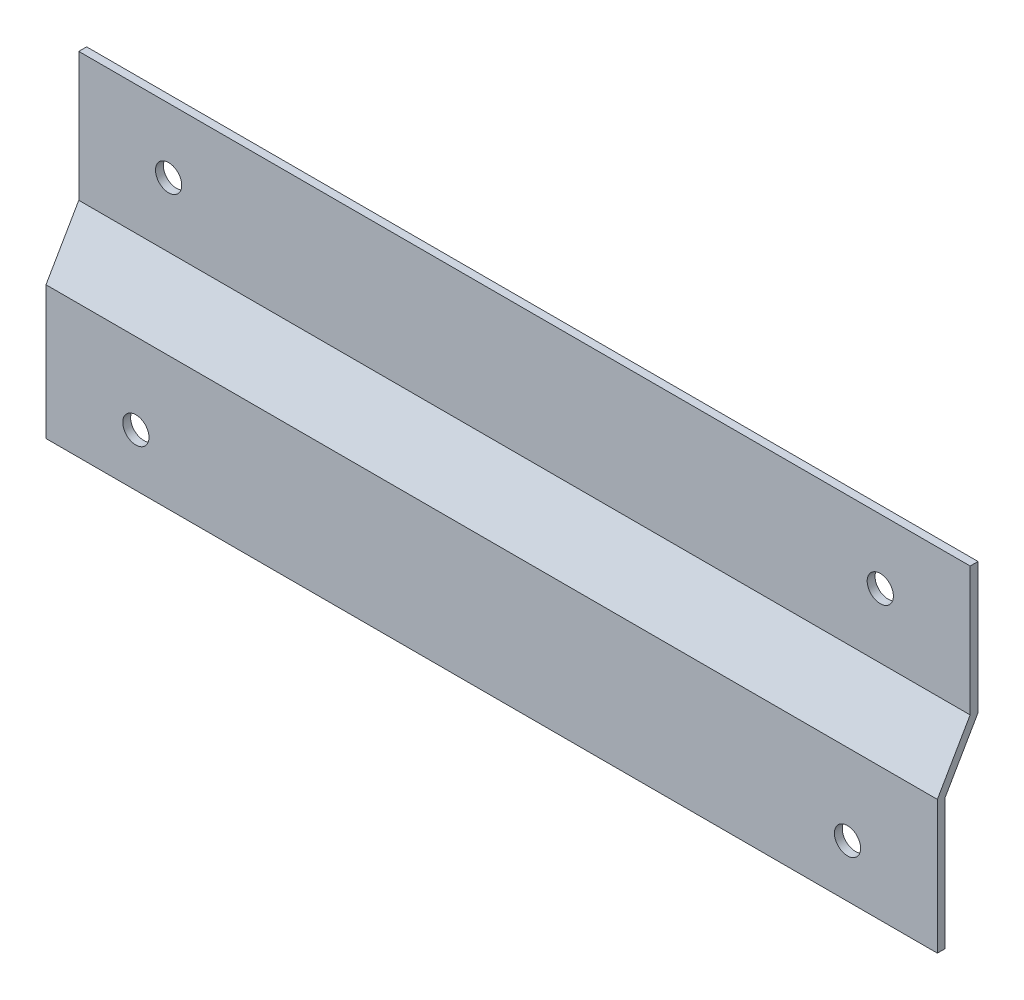
ISO-10303-21;
HEADER;
FILE_DESCRIPTION(('STEP AP214'),'2;1');
FILE_NAME('part.step','',(''),(''),'','','');
FILE_SCHEMA(('AUTOMOTIVE_DESIGN { 1 0 10303 214 1 1 1 1 }'));
ENDSEC;
DATA;
#1=APPLICATION_CONTEXT('core data for automotive mechanical design processes');
#2=APPLICATION_PROTOCOL_DEFINITION('international standard','automotive_design',2000,#1);
#3=PRODUCT_CONTEXT('',#1,'mechanical');
#4=PRODUCT('Part','Part','',(#3));
#5=PRODUCT_RELATED_PRODUCT_CATEGORY('part','',(#4));
#6=PRODUCT_DEFINITION_FORMATION('','',#4);
#7=PRODUCT_DEFINITION_CONTEXT('part definition',#1,'design');
#8=PRODUCT_DEFINITION('design','',#6,#7);
#9=PRODUCT_DEFINITION_SHAPE('','',#8);
#10=(LENGTH_UNIT() NAMED_UNIT(*) SI_UNIT(.MILLI.,.METRE.));
#11=(NAMED_UNIT(*) PLANE_ANGLE_UNIT() SI_UNIT($,.RADIAN.));
#12=(NAMED_UNIT(*) SI_UNIT($,.STERADIAN.) SOLID_ANGLE_UNIT());
#13=UNCERTAINTY_MEASURE_WITH_UNIT(LENGTH_MEASURE(1.E-05),#10,'distance_accuracy_value','');
#14=(GEOMETRIC_REPRESENTATION_CONTEXT(3) GLOBAL_UNCERTAINTY_ASSIGNED_CONTEXT((#13)) GLOBAL_UNIT_ASSIGNED_CONTEXT((#10,
#11,#12)) REPRESENTATION_CONTEXT('',''));
#15=CARTESIAN_POINT('',(0.,0.,0.));
#16=DIRECTION('',(0.,0.,1.));
#17=DIRECTION('',(1.,0.,0.));
#18=AXIS2_PLACEMENT_3D('',#15,#16,#17);
#19=CARTESIAN_POINT('',(-170.,-21.650635094611,15.5));
#20=DIRECTION('',(0.,0.,1.));
#21=DIRECTION('',(0.,-1.,0.));
#22=AXIS2_PLACEMENT_3D('',#19,#20,#21);
#23=PLANE('',#22);
#24=CARTESIAN_POINT('',(135.725,-51.6506350946109,15.5));
#25=DIRECTION('',(0.,0.,1.));
#26=DIRECTION('',(0.,-1.,0.));
#27=AXIS2_PLACEMENT_3D('',#24,#25,#26);
#28=CIRCLE('',#27,4.99999999999999);
#29=CARTESIAN_POINT('',(135.725,-56.6506350946109,15.5));
#30=VERTEX_POINT('',#29);
#31=EDGE_CURVE('E202',#30,#30,#28,.T.);
#32=ORIENTED_EDGE('',*,*,#31,.F.);
#33=EDGE_LOOP('',(#32));
#34=FACE_BOUND('',#33,.T.);
#35=CARTESIAN_POINT('',(-135.725,-51.6506350946109,15.5));
#36=DIRECTION('',(0.,0.,1.));
#37=DIRECTION('',(0.,-1.,0.));
#38=AXIS2_PLACEMENT_3D('',#35,#36,#37);
#39=CIRCLE('',#38,4.99999999999999);
#40=CARTESIAN_POINT('',(-135.725,-56.6506350946109,15.5));
#41=VERTEX_POINT('',#40);
#42=EDGE_CURVE('E194',#41,#41,#39,.F.);
#43=ORIENTED_EDGE('',*,*,#42,.T.);
#44=EDGE_LOOP('',(#43));
#45=FACE_BOUND('',#44,.T.);
#46=DIRECTION('',(1.,0.,0.));
#47=VECTOR('',#46,1.);
#48=CARTESIAN_POINT('',(-170.,-71.6506350946109,15.5));
#49=LINE('',#48,#47);
#50=CARTESIAN_POINT('',(-170.,-71.6506350946109,15.5));
#51=VERTEX_POINT('',#50);
#52=CARTESIAN_POINT('',(170.,-71.6506350946109,15.5));
#53=VERTEX_POINT('',#52);
#54=EDGE_CURVE('E103',#51,#53,#49,.T.);
#55=ORIENTED_EDGE('',*,*,#54,.T.);
#56=DIRECTION('',(0.,-1.,0.));
#57=VECTOR('',#56,1.);
#58=CARTESIAN_POINT('',(170.,-21.650635094611,15.5));
#59=LINE('',#58,#57);
#60=CARTESIAN_POINT('',(170.,-20.8467875173176,15.5));
#61=VERTEX_POINT('',#60);
#62=EDGE_CURVE('E105',#61,#53,#59,.T.);
#63=ORIENTED_EDGE('',*,*,#62,.F.);
#64=DIRECTION('',(1.,0.,0.));
#65=VECTOR('',#64,1.);
#66=CARTESIAN_POINT('',(-170.,-20.8467875173176,15.5));
#67=LINE('',#66,#65);
#68=CARTESIAN_POINT('',(-170.,-20.8467875173176,15.5));
#69=VERTEX_POINT('',#68);
#70=EDGE_CURVE('E11',#69,#61,#67,.T.);
#71=ORIENTED_EDGE('',*,*,#70,.F.);
#72=DIRECTION('',(0.,-1.,0.));
#73=VECTOR('',#72,1.);
#74=CARTESIAN_POINT('',(-170.,-21.650635094611,15.5));
#75=LINE('',#74,#73);
#76=EDGE_CURVE('E106',#69,#51,#75,.T.);
#77=ORIENTED_EDGE('',*,*,#76,.T.);
#78=EDGE_LOOP('',(#55,#63,#71,#77));
#79=FACE_BOUND('',#78,.T.);
#80=ADVANCED_FACE('F39',(#34,#45,#79),#23,.T.);
#81=CARTESIAN_POINT('',(-170.,1.5,2.59807621135331));
#82=DIRECTION('',(0.,0.500000000000001,0.866025403784438));
#83=DIRECTION('',(0.,-0.866025403784438,0.500000000000001));
#84=AXIS2_PLACEMENT_3D('',#81,#82,#83);
#85=PLANE('',#84);
#86=ORIENTED_EDGE('',*,*,#70,.T.);
#87=DIRECTION('',(0.,-0.866025403784438,0.500000000000001));
#88=VECTOR('',#87,1.);
#89=CARTESIAN_POINT('',(170.,1.5,2.59807621135331));
#90=LINE('',#89,#88);
#91=CARTESIAN_POINT('',(170.,0.803847577293369,3.));
#92=VERTEX_POINT('',#91);
#93=EDGE_CURVE('E122',#92,#61,#90,.T.);
#94=ORIENTED_EDGE('',*,*,#93,.F.);
#95=DIRECTION('',(1.,0.,0.));
#96=VECTOR('',#95,1.);
#97=CARTESIAN_POINT('',(-170.,0.803847577293369,3.));
#98=LINE('',#97,#96);
#99=CARTESIAN_POINT('',(-170.,0.803847577293369,3.));
#100=VERTEX_POINT('',#99);
#101=EDGE_CURVE('E48',#100,#92,#98,.T.);
#102=ORIENTED_EDGE('',*,*,#101,.F.);
#103=DIRECTION('',(0.,-0.866025403784438,0.500000000000001));
#104=VECTOR('',#103,1.);
#105=CARTESIAN_POINT('',(-170.,1.5,2.59807621135331));
#106=LINE('',#105,#104);
#107=EDGE_CURVE('E112',#100,#69,#106,.T.);
#108=ORIENTED_EDGE('',*,*,#107,.T.);
#109=EDGE_LOOP('',(#86,#94,#102,#108));
#110=FACE_BOUND('',#109,.T.);
#111=ADVANCED_FACE('F250',(#110),#85,.T.);
#112=CARTESIAN_POINT('',(-170.,50.,3.));
#113=DIRECTION('',(0.,0.,1.));
#114=DIRECTION('',(0.,-1.,0.));
#115=AXIS2_PLACEMENT_3D('',#112,#113,#114);
#116=PLANE('',#115);
#117=CARTESIAN_POINT('',(135.725,25.4019237886467,3.));
#118=DIRECTION('',(0.,0.,1.));
#119=DIRECTION('',(0.,-1.,0.));
#120=AXIS2_PLACEMENT_3D('',#117,#118,#119);
#121=CIRCLE('',#120,4.99999999999999);
#122=CARTESIAN_POINT('',(135.725,20.4019237886467,3.));
#123=VERTEX_POINT('',#122);
#124=EDGE_CURVE('E195',#123,#123,#121,.T.);
#125=ORIENTED_EDGE('',*,*,#124,.F.);
#126=EDGE_LOOP('',(#125));
#127=FACE_BOUND('',#126,.T.);
#128=CARTESIAN_POINT('',(-135.725,25.4019237886467,3.));
#129=DIRECTION('',(0.,0.,1.));
#130=DIRECTION('',(0.,-1.,0.));
#131=AXIS2_PLACEMENT_3D('',#128,#129,#130);
#132=CIRCLE('',#131,4.99999999999999);
#133=CARTESIAN_POINT('',(-135.725,20.4019237886467,3.));
#134=VERTEX_POINT('',#133);
#135=EDGE_CURVE('E124',#134,#134,#132,.F.);
#136=ORIENTED_EDGE('',*,*,#135,.T.);
#137=EDGE_LOOP('',(#136));
#138=FACE_BOUND('',#137,.T.);
#139=ORIENTED_EDGE('',*,*,#101,.T.);
#140=DIRECTION('',(0.,-1.,0.));
#141=VECTOR('',#140,1.);
#142=CARTESIAN_POINT('',(170.,50.,3.));
#143=LINE('',#142,#141);
#144=CARTESIAN_POINT('',(170.,50.,3.));
#145=VERTEX_POINT('',#144);
#146=EDGE_CURVE('E147',#145,#92,#143,.T.);
#147=ORIENTED_EDGE('',*,*,#146,.F.);
#148=DIRECTION('',(1.,0.,0.));
#149=VECTOR('',#148,1.);
#150=CARTESIAN_POINT('',(-170.,50.,3.));
#151=LINE('',#150,#149);
#152=CARTESIAN_POINT('',(-170.,50.,3.));
#153=VERTEX_POINT('',#152);
#154=EDGE_CURVE('E176',#153,#145,#151,.T.);
#155=ORIENTED_EDGE('',*,*,#154,.F.);
#156=DIRECTION('',(0.,-1.,0.));
#157=VECTOR('',#156,1.);
#158=CARTESIAN_POINT('',(-170.,50.,3.));
#159=LINE('',#158,#157);
#160=EDGE_CURVE('E169',#153,#100,#159,.T.);
#161=ORIENTED_EDGE('',*,*,#160,.T.);
#162=EDGE_LOOP('',(#139,#147,#155,#161));
#163=FACE_BOUND('',#162,.T.);
#164=ADVANCED_FACE('F222',(#127,#138,#163),#116,.T.);
#165=CARTESIAN_POINT('',(-170.,50.,3.));
#166=DIRECTION('',(0.,-1.,0.));
#167=DIRECTION('',(0.,0.,-1.));
#168=AXIS2_PLACEMENT_3D('',#165,#166,#167);
#169=PLANE('',#168);
#170=ORIENTED_EDGE('',*,*,#154,.T.);
#171=DIRECTION('',(0.,0.,-1.));
#172=VECTOR('',#171,1.);
#173=CARTESIAN_POINT('',(170.,50.,3.));
#174=LINE('',#173,#172);
#175=CARTESIAN_POINT('',(170.,50.,0.));
#176=VERTEX_POINT('',#175);
#177=EDGE_CURVE('E143',#145,#176,#174,.T.);
#178=ORIENTED_EDGE('',*,*,#177,.T.);
#179=DIRECTION('',(1.,0.,0.));
#180=VECTOR('',#179,1.);
#181=CARTESIAN_POINT('',(-170.,50.,0.));
#182=LINE('',#181,#180);
#183=CARTESIAN_POINT('',(-170.,50.,0.));
#184=VERTEX_POINT('',#183);
#185=EDGE_CURVE('E179',#184,#176,#182,.T.);
#186=ORIENTED_EDGE('',*,*,#185,.F.);
#187=DIRECTION('',(0.,0.,-1.));
#188=VECTOR('',#187,1.);
#189=CARTESIAN_POINT('',(-170.,50.,3.));
#190=LINE('',#189,#188);
#191=EDGE_CURVE('E166',#153,#184,#190,.T.);
#192=ORIENTED_EDGE('',*,*,#191,.F.);
#193=EDGE_LOOP('',(#170,#178,#186,#192));
#194=FACE_BOUND('',#193,.T.);
#195=ADVANCED_FACE('F237',(#194),#169,.F.);
#196=CARTESIAN_POINT('',(-170.,50.,0.));
#197=DIRECTION('',(0.,0.,1.));
#198=DIRECTION('',(0.,-1.,0.));
#199=AXIS2_PLACEMENT_3D('',#196,#197,#198);
#200=PLANE('',#199);
#201=CARTESIAN_POINT('',(135.725,25.4019237886467,0.));
#202=DIRECTION('',(0.,0.,1.));
#203=DIRECTION('',(0.,-1.,0.));
#204=AXIS2_PLACEMENT_3D('',#201,#202,#203);
#205=CIRCLE('',#204,4.99999999999999);
#206=CARTESIAN_POINT('',(135.725,20.4019237886467,0.));
#207=VERTEX_POINT('',#206);
#208=EDGE_CURVE('E42',#207,#207,#205,.T.);
#209=ORIENTED_EDGE('',*,*,#208,.T.);
#210=EDGE_LOOP('',(#209));
#211=FACE_BOUND('',#210,.T.);
#212=CARTESIAN_POINT('',(-135.725,25.4019237886467,0.));
#213=DIRECTION('',(0.,0.,1.));
#214=DIRECTION('',(0.,-1.,0.));
#215=AXIS2_PLACEMENT_3D('',#212,#213,#214);
#216=CIRCLE('',#215,4.99999999999999);
#217=CARTESIAN_POINT('',(-135.725,20.4019237886467,0.));
#218=VERTEX_POINT('',#217);
#219=EDGE_CURVE('E196',#218,#218,#216,.F.);
#220=ORIENTED_EDGE('',*,*,#219,.F.);
#221=EDGE_LOOP('',(#220));
#222=FACE_BOUND('',#221,.T.);
#223=ORIENTED_EDGE('',*,*,#185,.T.);
#224=DIRECTION('',(0.,-1.,0.));
#225=VECTOR('',#224,1.);
#226=CARTESIAN_POINT('',(170.,50.,0.));
#227=LINE('',#226,#225);
#228=CARTESIAN_POINT('',(170.,0.,0.));
#229=VERTEX_POINT('',#228);
#230=EDGE_CURVE('E139',#176,#229,#227,.T.);
#231=ORIENTED_EDGE('',*,*,#230,.T.);
#232=DIRECTION('',(1.,0.,0.));
#233=VECTOR('',#232,1.);
#234=CARTESIAN_POINT('',(-170.,0.,0.));
#235=LINE('',#234,#233);
#236=CARTESIAN_POINT('',(-170.,0.,0.));
#237=VERTEX_POINT('',#236);
#238=EDGE_CURVE('E182',#237,#229,#235,.T.);
#239=ORIENTED_EDGE('',*,*,#238,.F.);
#240=DIRECTION('',(0.,-1.,0.));
#241=VECTOR('',#240,1.);
#242=CARTESIAN_POINT('',(-170.,50.,0.));
#243=LINE('',#242,#241);
#244=EDGE_CURVE('E163',#184,#237,#243,.T.);
#245=ORIENTED_EDGE('',*,*,#244,.F.);
#246=EDGE_LOOP('',(#223,#231,#239,#245));
#247=FACE_BOUND('',#246,.T.);
#248=ADVANCED_FACE('F233',(#211,#222,#247),#200,.F.);
#249=CARTESIAN_POINT('',(-170.,0.,0.));
#250=DIRECTION('',(0.,0.500000000000001,0.866025403784438));
#251=DIRECTION('',(0.,-0.866025403784438,0.500000000000001));
#252=AXIS2_PLACEMENT_3D('',#249,#250,#251);
#253=PLANE('',#252);
#254=ORIENTED_EDGE('',*,*,#238,.T.);
#255=DIRECTION('',(0.,-0.866025403784438,0.500000000000001));
#256=VECTOR('',#255,1.);
#257=CARTESIAN_POINT('',(170.,0.,0.));
#258=LINE('',#257,#256);
#259=CARTESIAN_POINT('',(170.,-21.650635094611,12.5));
#260=VERTEX_POINT('',#259);
#261=EDGE_CURVE('E132',#229,#260,#258,.T.);
#262=ORIENTED_EDGE('',*,*,#261,.T.);
#263=DIRECTION('',(1.,0.,0.));
#264=VECTOR('',#263,1.);
#265=CARTESIAN_POINT('',(-170.,-21.650635094611,12.5));
#266=LINE('',#265,#264);
#267=CARTESIAN_POINT('',(-170.,-21.650635094611,12.5));
#268=VERTEX_POINT('',#267);
#269=EDGE_CURVE('E185',#268,#260,#266,.T.);
#270=ORIENTED_EDGE('',*,*,#269,.F.);
#271=DIRECTION('',(0.,-0.866025403784438,0.500000000000001));
#272=VECTOR('',#271,1.);
#273=CARTESIAN_POINT('',(-170.,0.,0.));
#274=LINE('',#273,#272);
#275=EDGE_CURVE('E160',#237,#268,#274,.T.);
#276=ORIENTED_EDGE('',*,*,#275,.F.);
#277=EDGE_LOOP('',(#254,#262,#270,#276));
#278=FACE_BOUND('',#277,.T.);
#279=ADVANCED_FACE('F236',(#278),#253,.F.);
#280=CARTESIAN_POINT('',(-170.,-21.650635094611,12.5));
#281=DIRECTION('',(0.,0.,1.));
#282=DIRECTION('',(0.,-1.,0.));
#283=AXIS2_PLACEMENT_3D('',#280,#281,#282);
#284=PLANE('',#283);
#285=CARTESIAN_POINT('',(135.725,-51.6506350946109,12.5));
#286=DIRECTION('',(0.,0.,1.));
#287=DIRECTION('',(0.,-1.,0.));
#288=AXIS2_PLACEMENT_3D('',#285,#286,#287);
#289=CIRCLE('',#288,4.99999999999999);
#290=CARTESIAN_POINT('',(135.725,-56.6506350946109,12.5));
#291=VERTEX_POINT('',#290);
#292=EDGE_CURVE('E199',#291,#291,#289,.T.);
#293=ORIENTED_EDGE('',*,*,#292,.T.);
#294=EDGE_LOOP('',(#293));
#295=FACE_BOUND('',#294,.T.);
#296=CARTESIAN_POINT('',(-135.725,-51.6506350946109,12.5));
#297=DIRECTION('',(0.,0.,1.));
#298=DIRECTION('',(0.,-1.,0.));
#299=AXIS2_PLACEMENT_3D('',#296,#297,#298);
#300=CIRCLE('',#299,4.99999999999999);
#301=CARTESIAN_POINT('',(-135.725,-56.6506350946109,12.5));
#302=VERTEX_POINT('',#301);
#303=EDGE_CURVE('E190',#302,#302,#300,.F.);
#304=ORIENTED_EDGE('',*,*,#303,.F.);
#305=EDGE_LOOP('',(#304));
#306=FACE_BOUND('',#305,.T.);
#307=ORIENTED_EDGE('',*,*,#269,.T.);
#308=DIRECTION('',(0.,-1.,0.));
#309=VECTOR('',#308,1.);
#310=CARTESIAN_POINT('',(170.,-21.650635094611,12.5));
#311=LINE('',#310,#309);
#312=CARTESIAN_POINT('',(170.,-71.6506350946109,12.5));
#313=VERTEX_POINT('',#312);
#314=EDGE_CURVE('E129',#260,#313,#311,.T.);
#315=ORIENTED_EDGE('',*,*,#314,.T.);
#316=DIRECTION('',(1.,0.,0.));
#317=VECTOR('',#316,1.);
#318=CARTESIAN_POINT('',(-170.,-71.6506350946109,12.5));
#319=LINE('',#318,#317);
#320=CARTESIAN_POINT('',(-170.,-71.6506350946109,12.5));
#321=VERTEX_POINT('',#320);
#322=EDGE_CURVE('E111',#321,#313,#319,.T.);
#323=ORIENTED_EDGE('',*,*,#322,.F.);
#324=DIRECTION('',(0.,-1.,0.));
#325=VECTOR('',#324,1.);
#326=CARTESIAN_POINT('',(-170.,-21.650635094611,12.5));
#327=LINE('',#326,#325);
#328=EDGE_CURVE('E157',#268,#321,#327,.T.);
#329=ORIENTED_EDGE('',*,*,#328,.F.);
#330=EDGE_LOOP('',(#307,#315,#323,#329));
#331=FACE_BOUND('',#330,.T.);
#332=ADVANCED_FACE('F258',(#295,#306,#331),#284,.F.);
#333=CARTESIAN_POINT('',(-170.,-71.6506350946109,12.5));
#334=DIRECTION('',(0.,1.,0.));
#335=DIRECTION('',(0.,0.,1.));
#336=AXIS2_PLACEMENT_3D('',#333,#334,#335);
#337=PLANE('',#336);
#338=ORIENTED_EDGE('',*,*,#322,.T.);
#339=DIRECTION('',(0.,0.,1.));
#340=VECTOR('',#339,1.);
#341=CARTESIAN_POINT('',(170.,-71.6506350946109,12.5));
#342=LINE('',#341,#340);
#343=EDGE_CURVE('E119',#313,#53,#342,.T.);
#344=ORIENTED_EDGE('',*,*,#343,.T.);
#345=ORIENTED_EDGE('',*,*,#54,.F.);
#346=DIRECTION('',(0.,0.,1.));
#347=VECTOR('',#346,1.);
#348=CARTESIAN_POINT('',(-170.,-71.6506350946109,12.5));
#349=LINE('',#348,#347);
#350=EDGE_CURVE('E154',#321,#51,#349,.T.);
#351=ORIENTED_EDGE('',*,*,#350,.F.);
#352=EDGE_LOOP('',(#338,#344,#345,#351));
#353=FACE_BOUND('',#352,.T.);
#354=ADVANCED_FACE('F126',(#353),#337,.F.);
#355=CARTESIAN_POINT('',(-170.,0.,0.));
#356=DIRECTION('',(-1.,0.,0.));
#357=DIRECTION('',(0.,0.,1.));
#358=AXIS2_PLACEMENT_3D('',#355,#356,#357);
#359=PLANE('',#358);
#360=ORIENTED_EDGE('',*,*,#76,.F.);
#361=ORIENTED_EDGE('',*,*,#107,.F.);
#362=ORIENTED_EDGE('',*,*,#160,.F.);
#363=ORIENTED_EDGE('',*,*,#191,.T.);
#364=ORIENTED_EDGE('',*,*,#244,.T.);
#365=ORIENTED_EDGE('',*,*,#275,.T.);
#366=ORIENTED_EDGE('',*,*,#328,.T.);
#367=ORIENTED_EDGE('',*,*,#350,.T.);
#368=EDGE_LOOP('',(#360,#361,#362,#363,#364,#365,#366,#367));
#369=FACE_BOUND('',#368,.T.);
#370=ADVANCED_FACE('F253',(#369),#359,.T.);
#371=CARTESIAN_POINT('',(170.,0.,0.));
#372=DIRECTION('',(-1.,0.,0.));
#373=DIRECTION('',(0.,0.,1.));
#374=AXIS2_PLACEMENT_3D('',#371,#372,#373);
#375=PLANE('',#374);
#376=ORIENTED_EDGE('',*,*,#62,.T.);
#377=ORIENTED_EDGE('',*,*,#343,.F.);
#378=ORIENTED_EDGE('',*,*,#314,.F.);
#379=ORIENTED_EDGE('',*,*,#261,.F.);
#380=ORIENTED_EDGE('',*,*,#230,.F.);
#381=ORIENTED_EDGE('',*,*,#177,.F.);
#382=ORIENTED_EDGE('',*,*,#146,.T.);
#383=ORIENTED_EDGE('',*,*,#93,.T.);
#384=EDGE_LOOP('',(#376,#377,#378,#379,#380,#381,#382,#383));
#385=FACE_BOUND('',#384,.T.);
#386=ADVANCED_FACE('F117',(#385),#375,.F.);
#387=CARTESIAN_POINT('',(-135.725,-51.6506350946109,43.));
#388=DIRECTION('',(0.,0.,-1.));
#389=DIRECTION('',(-1.,0.,0.));
#390=AXIS2_PLACEMENT_3D('',#387,#388,#389);
#391=CYLINDRICAL_SURFACE('',#390,4.99999999999999);
#392=ORIENTED_EDGE('',*,*,#42,.F.);
#393=EDGE_LOOP('',(#392));
#394=FACE_BOUND('',#393,.T.);
#395=ORIENTED_EDGE('',*,*,#303,.T.);
#396=EDGE_LOOP('',(#395));
#397=FACE_BOUND('',#396,.T.);
#398=ADVANCED_FACE('F229',(#394,#397),#391,.F.);
#399=CARTESIAN_POINT('',(-135.725,25.4019237886467,43.));
#400=DIRECTION('',(0.,0.,-1.));
#401=DIRECTION('',(-1.,0.,0.));
#402=AXIS2_PLACEMENT_3D('',#399,#400,#401);
#403=CYLINDRICAL_SURFACE('',#402,4.99999999999999);
#404=ORIENTED_EDGE('',*,*,#135,.F.);
#405=EDGE_LOOP('',(#404));
#406=FACE_BOUND('',#405,.T.);
#407=ORIENTED_EDGE('',*,*,#219,.T.);
#408=EDGE_LOOP('',(#407));
#409=FACE_BOUND('',#408,.T.);
#410=ADVANCED_FACE('F225',(#406,#409),#403,.F.);
#411=CARTESIAN_POINT('',(135.725,-51.6506350946109,43.));
#412=DIRECTION('',(0.,0.,-1.));
#413=DIRECTION('',(-1.,0.,0.));
#414=AXIS2_PLACEMENT_3D('',#411,#412,#413);
#415=CYLINDRICAL_SURFACE('',#414,4.99999999999999);
#416=ORIENTED_EDGE('',*,*,#31,.T.);
#417=EDGE_LOOP('',(#416));
#418=FACE_BOUND('',#417,.T.);
#419=ORIENTED_EDGE('',*,*,#292,.F.);
#420=EDGE_LOOP('',(#419));
#421=FACE_BOUND('',#420,.T.);
#422=ADVANCED_FACE('F228',(#418,#421),#415,.F.);
#423=CARTESIAN_POINT('',(135.725,25.4019237886467,43.));
#424=DIRECTION('',(0.,0.,-1.));
#425=DIRECTION('',(-1.,0.,0.));
#426=AXIS2_PLACEMENT_3D('',#423,#424,#425);
#427=CYLINDRICAL_SURFACE('',#426,4.99999999999999);
#428=ORIENTED_EDGE('',*,*,#124,.T.);
#429=EDGE_LOOP('',(#428));
#430=FACE_BOUND('',#429,.T.);
#431=ORIENTED_EDGE('',*,*,#208,.F.);
#432=EDGE_LOOP('',(#431));
#433=FACE_BOUND('',#432,.T.);
#434=ADVANCED_FACE('F321',(#430,#433),#427,.F.);
#435=CLOSED_SHELL('',(#80,#111,#164,#195,#248,#279,#332,#354,#370,#386,#398,#410,#422,#434));
#436=MANIFOLD_SOLID_BREP('B2',#435);
#437=ADVANCED_BREP_SHAPE_REPRESENTATION('',(#18,#436),#14);
#438=SHAPE_DEFINITION_REPRESENTATION(#9,#437);
ENDSEC;
END-ISO-10303-21;
